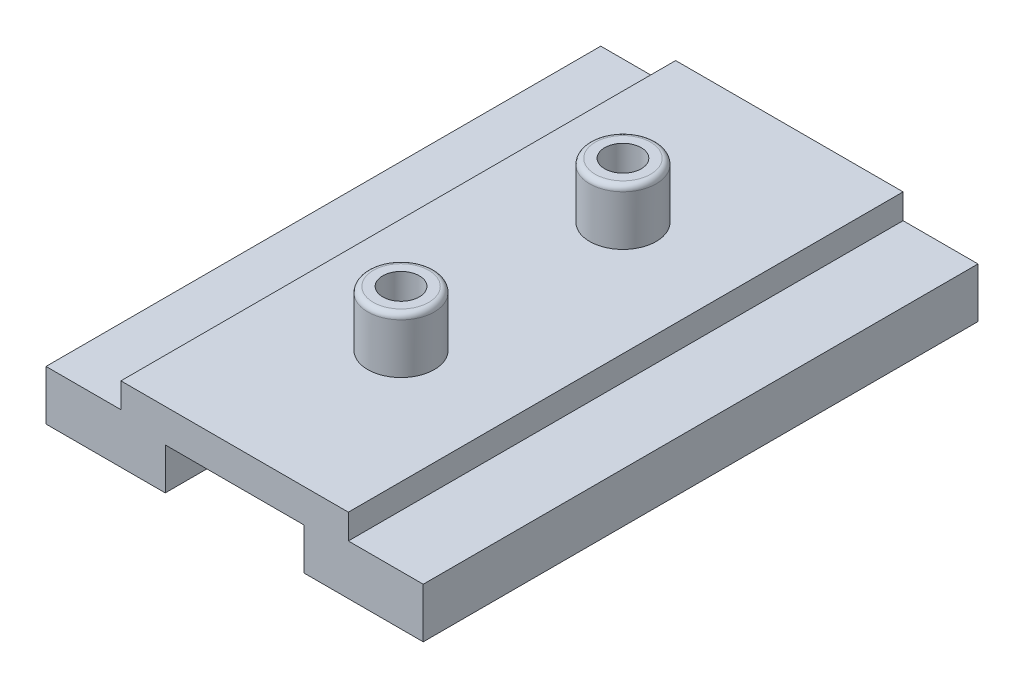
ISO-10303-21;
HEADER;
FILE_DESCRIPTION(('STEP AP214'),'2;1');
FILE_NAME('part.step','',(''),(''),'','','');
FILE_SCHEMA(('AUTOMOTIVE_DESIGN { 1 0 10303 214 1 1 1 1 }'));
ENDSEC;
DATA;
#1=APPLICATION_CONTEXT('core data for automotive mechanical design processes');
#2=APPLICATION_PROTOCOL_DEFINITION('international standard','automotive_design',2000,#1);
#3=PRODUCT_CONTEXT('',#1,'mechanical');
#4=PRODUCT('Part','Part','',(#3));
#5=PRODUCT_RELATED_PRODUCT_CATEGORY('part','',(#4));
#6=PRODUCT_DEFINITION_FORMATION('','',#4);
#7=PRODUCT_DEFINITION_CONTEXT('part definition',#1,'design');
#8=PRODUCT_DEFINITION('design','',#6,#7);
#9=PRODUCT_DEFINITION_SHAPE('','',#8);
#10=(LENGTH_UNIT() NAMED_UNIT(*) SI_UNIT(.MILLI.,.METRE.));
#11=(NAMED_UNIT(*) PLANE_ANGLE_UNIT() SI_UNIT($,.RADIAN.));
#12=(NAMED_UNIT(*) SI_UNIT($,.STERADIAN.) SOLID_ANGLE_UNIT());
#13=UNCERTAINTY_MEASURE_WITH_UNIT(LENGTH_MEASURE(1.E-05),#10,'distance_accuracy_value','');
#14=(GEOMETRIC_REPRESENTATION_CONTEXT(3) GLOBAL_UNCERTAINTY_ASSIGNED_CONTEXT((#13)) GLOBAL_UNIT_ASSIGNED_CONTEXT((#10,
#11,#12)) REPRESENTATION_CONTEXT('',''));
#15=CARTESIAN_POINT('',(0.,0.,0.));
#16=DIRECTION('',(0.,0.,1.));
#17=DIRECTION('',(1.,0.,0.));
#18=AXIS2_PLACEMENT_3D('',#15,#16,#17);
#19=CARTESIAN_POINT('',(6.75,6.75,50.));
#20=DIRECTION('',(0.,-1.,0.));
#21=DIRECTION('',(0.,0.,-1.));
#22=AXIS2_PLACEMENT_3D('',#19,#20,#21);
#23=PLANE('',#22);
#24=CARTESIAN_POINT('',(17.,6.75,15.));
#25=DIRECTION('',(0.,-1.,0.));
#26=DIRECTION('',(0.,0.,-1.));
#27=AXIS2_PLACEMENT_3D('',#24,#25,#26);
#28=CIRCLE('',#27,3.);
#29=CARTESIAN_POINT('',(17.,6.75,12.));
#30=VERTEX_POINT('',#29);
#31=EDGE_CURVE('E206',#30,#30,#28,.F.);
#32=ORIENTED_EDGE('',*,*,#31,.F.);
#33=EDGE_LOOP('',(#32));
#34=FACE_BOUND('',#33,.T.);
#35=DIRECTION('',(-1.,0.,0.));
#36=VECTOR('',#35,1.);
#37=CARTESIAN_POINT('',(6.75,6.75,0.));
#38=LINE('',#37,#36);
#39=CARTESIAN_POINT('',(27.25,6.75,0.));
#40=VERTEX_POINT('',#39);
#41=CARTESIAN_POINT('',(6.75,6.75,0.));
#42=VERTEX_POINT('',#41);
#43=EDGE_CURVE('E174',#40,#42,#38,.T.);
#44=ORIENTED_EDGE('',*,*,#43,.T.);
#45=DIRECTION('',(0.,0.,-1.));
#46=VECTOR('',#45,1.);
#47=CARTESIAN_POINT('',(6.75,6.75,50.));
#48=LINE('',#47,#46);
#49=CARTESIAN_POINT('',(6.75,6.75,50.));
#50=VERTEX_POINT('',#49);
#51=EDGE_CURVE('E147',#50,#42,#48,.T.);
#52=ORIENTED_EDGE('',*,*,#51,.F.);
#53=DIRECTION('',(-1.,0.,0.));
#54=VECTOR('',#53,1.);
#55=CARTESIAN_POINT('',(6.75,6.75,50.));
#56=LINE('',#55,#54);
#57=CARTESIAN_POINT('',(27.25,6.75,50.));
#58=VERTEX_POINT('',#57);
#59=EDGE_CURVE('E138',#58,#50,#56,.T.);
#60=ORIENTED_EDGE('',*,*,#59,.F.);
#61=DIRECTION('',(0.,0.,-1.));
#62=VECTOR('',#61,1.);
#63=CARTESIAN_POINT('',(27.25,6.75,50.));
#64=LINE('',#63,#62);
#65=EDGE_CURVE('E183',#58,#40,#64,.T.);
#66=ORIENTED_EDGE('',*,*,#65,.T.);
#67=EDGE_LOOP('',(#44,#52,#60,#66));
#68=FACE_BOUND('',#67,.T.);
#69=CARTESIAN_POINT('',(17.,6.75,35.));
#70=DIRECTION('',(0.,-1.,0.));
#71=DIRECTION('',(0.,0.,-1.));
#72=AXIS2_PLACEMENT_3D('',#69,#70,#71);
#73=CIRCLE('',#72,3.);
#74=CARTESIAN_POINT('',(17.,6.75,32.));
#75=VERTEX_POINT('',#74);
#76=EDGE_CURVE('E209',#75,#75,#73,.F.);
#77=ORIENTED_EDGE('',*,*,#76,.F.);
#78=EDGE_LOOP('',(#77));
#79=FACE_BOUND('',#78,.T.);
#80=ADVANCED_FACE('F34',(#34,#68,#79),#23,.F.);
#81=CARTESIAN_POINT('',(10.75,0.,50.));
#82=DIRECTION('',(0.,1.,0.));
#83=DIRECTION('',(-1.,0.,0.));
#84=AXIS2_PLACEMENT_3D('',#81,#82,#83);
#85=PLANE('',#84);
#86=DIRECTION('',(1.,0.,0.));
#87=VECTOR('',#86,1.);
#88=CARTESIAN_POINT('',(10.75,0.,0.));
#89=LINE('',#88,#87);
#90=CARTESIAN_POINT('',(0.,0.,0.));
#91=VERTEX_POINT('',#90);
#92=CARTESIAN_POINT('',(10.75,0.,0.));
#93=VERTEX_POINT('',#92);
#94=EDGE_CURVE('E156',#91,#93,#89,.T.);
#95=ORIENTED_EDGE('',*,*,#94,.T.);
#96=DIRECTION('',(0.,0.,-1.));
#97=VECTOR('',#96,1.);
#98=CARTESIAN_POINT('',(10.75,0.,50.));
#99=LINE('',#98,#97);
#100=CARTESIAN_POINT('',(10.75,0.,50.));
#101=VERTEX_POINT('',#100);
#102=EDGE_CURVE('E204',#101,#93,#99,.T.);
#103=ORIENTED_EDGE('',*,*,#102,.F.);
#104=DIRECTION('',(1.,0.,0.));
#105=VECTOR('',#104,1.);
#106=CARTESIAN_POINT('',(10.75,0.,50.));
#107=LINE('',#106,#105);
#108=CARTESIAN_POINT('',(0.,0.,50.));
#109=VERTEX_POINT('',#108);
#110=EDGE_CURVE('E179',#109,#101,#107,.T.);
#111=ORIENTED_EDGE('',*,*,#110,.F.);
#112=DIRECTION('',(0.,0.,-1.));
#113=VECTOR('',#112,1.);
#114=CARTESIAN_POINT('',(0.,0.,50.));
#115=LINE('',#114,#113);
#116=EDGE_CURVE('E152',#109,#91,#115,.T.);
#117=ORIENTED_EDGE('',*,*,#116,.T.);
#118=EDGE_LOOP('',(#95,#103,#111,#117));
#119=FACE_BOUND('',#118,.T.);
#120=ADVANCED_FACE('F238',(#119),#85,.F.);
#121=CARTESIAN_POINT('',(10.75,3.75,50.));
#122=DIRECTION('',(-1.,0.,0.));
#123=DIRECTION('',(0.,0.,1.));
#124=AXIS2_PLACEMENT_3D('',#121,#122,#123);
#125=PLANE('',#124);
#126=DIRECTION('',(0.,1.,0.));
#127=VECTOR('',#126,1.);
#128=CARTESIAN_POINT('',(10.75,3.75,0.));
#129=LINE('',#128,#127);
#130=CARTESIAN_POINT('',(10.75,3.75,0.));
#131=VERTEX_POINT('',#130);
#132=EDGE_CURVE('E159',#93,#131,#129,.T.);
#133=ORIENTED_EDGE('',*,*,#132,.T.);
#134=DIRECTION('',(0.,0.,-1.));
#135=VECTOR('',#134,1.);
#136=CARTESIAN_POINT('',(10.75,3.75,50.));
#137=LINE('',#136,#135);
#138=CARTESIAN_POINT('',(10.75,3.75,50.));
#139=VERTEX_POINT('',#138);
#140=EDGE_CURVE('E201',#139,#131,#137,.T.);
#141=ORIENTED_EDGE('',*,*,#140,.F.);
#142=DIRECTION('',(0.,1.,0.));
#143=VECTOR('',#142,1.);
#144=CARTESIAN_POINT('',(10.75,3.75,50.));
#145=LINE('',#144,#143);
#146=EDGE_CURVE('E107',#101,#139,#145,.T.);
#147=ORIENTED_EDGE('',*,*,#146,.F.);
#148=ORIENTED_EDGE('',*,*,#102,.T.);
#149=EDGE_LOOP('',(#133,#141,#147,#148));
#150=FACE_BOUND('',#149,.T.);
#151=ADVANCED_FACE('F244',(#150),#125,.F.);
#152=CARTESIAN_POINT('',(10.75,3.75,50.));
#153=DIRECTION('',(0.,1.,0.));
#154=DIRECTION('',(0.,0.,1.));
#155=AXIS2_PLACEMENT_3D('',#152,#153,#154);
#156=PLANE('',#155);
#157=CARTESIAN_POINT('',(17.,3.75,15.));
#158=DIRECTION('',(0.,1.,0.));
#159=DIRECTION('',(0.,0.,1.));
#160=AXIS2_PLACEMENT_3D('',#157,#158,#159);
#161=CIRCLE('',#160,1.65);
#162=CARTESIAN_POINT('',(17.,3.75,16.65));
#163=VERTEX_POINT('',#162);
#164=EDGE_CURVE('E213',#163,#163,#161,.T.);
#165=ORIENTED_EDGE('',*,*,#164,.T.);
#166=EDGE_LOOP('',(#165));
#167=FACE_BOUND('',#166,.T.);
#168=CARTESIAN_POINT('',(17.,3.75,35.));
#169=DIRECTION('',(0.,1.,0.));
#170=DIRECTION('',(0.,0.,1.));
#171=AXIS2_PLACEMENT_3D('',#168,#169,#170);
#172=CIRCLE('',#171,1.65);
#173=CARTESIAN_POINT('',(17.,3.75,36.65));
#174=VERTEX_POINT('',#173);
#175=EDGE_CURVE('E160',#174,#174,#172,.T.);
#176=ORIENTED_EDGE('',*,*,#175,.T.);
#177=EDGE_LOOP('',(#176));
#178=FACE_BOUND('',#177,.T.);
#179=DIRECTION('',(1.,0.,0.));
#180=VECTOR('',#179,1.);
#181=CARTESIAN_POINT('',(10.75,3.75,0.));
#182=LINE('',#181,#180);
#183=CARTESIAN_POINT('',(23.25,3.75,0.));
#184=VERTEX_POINT('',#183);
#185=EDGE_CURVE('E162',#131,#184,#182,.T.);
#186=ORIENTED_EDGE('',*,*,#185,.T.);
#187=DIRECTION('',(0.,0.,-1.));
#188=VECTOR('',#187,1.);
#189=CARTESIAN_POINT('',(23.25,3.75,50.));
#190=LINE('',#189,#188);
#191=CARTESIAN_POINT('',(23.25,3.75,50.));
#192=VERTEX_POINT('',#191);
#193=EDGE_CURVE('E198',#192,#184,#190,.T.);
#194=ORIENTED_EDGE('',*,*,#193,.F.);
#195=DIRECTION('',(1.,0.,0.));
#196=VECTOR('',#195,1.);
#197=CARTESIAN_POINT('',(10.75,3.75,50.));
#198=LINE('',#197,#196);
#199=EDGE_CURVE('E286',#139,#192,#198,.T.);
#200=ORIENTED_EDGE('',*,*,#199,.F.);
#201=ORIENTED_EDGE('',*,*,#140,.T.);
#202=EDGE_LOOP('',(#186,#194,#200,#201));
#203=FACE_BOUND('',#202,.T.);
#204=ADVANCED_FACE('F271',(#167,#178,#203),#156,.F.);
#205=CARTESIAN_POINT('',(23.25,3.75,50.));
#206=DIRECTION('',(1.,0.,0.));
#207=DIRECTION('',(0.,0.,-1.));
#208=AXIS2_PLACEMENT_3D('',#205,#206,#207);
#209=PLANE('',#208);
#210=DIRECTION('',(0.,-1.,0.));
#211=VECTOR('',#210,1.);
#212=CARTESIAN_POINT('',(23.25,3.75,0.));
#213=LINE('',#212,#211);
#214=CARTESIAN_POINT('',(23.25,0.,0.));
#215=VERTEX_POINT('',#214);
#216=EDGE_CURVE('E164',#184,#215,#213,.T.);
#217=ORIENTED_EDGE('',*,*,#216,.T.);
#218=DIRECTION('',(0.,0.,-1.));
#219=VECTOR('',#218,1.);
#220=CARTESIAN_POINT('',(23.25,0.,50.));
#221=LINE('',#220,#219);
#222=CARTESIAN_POINT('',(23.25,0.,50.));
#223=VERTEX_POINT('',#222);
#224=EDGE_CURVE('E195',#223,#215,#221,.T.);
#225=ORIENTED_EDGE('',*,*,#224,.F.);
#226=DIRECTION('',(0.,-1.,0.));
#227=VECTOR('',#226,1.);
#228=CARTESIAN_POINT('',(23.25,3.75,50.));
#229=LINE('',#228,#227);
#230=EDGE_CURVE('E298',#192,#223,#229,.T.);
#231=ORIENTED_EDGE('',*,*,#230,.F.);
#232=ORIENTED_EDGE('',*,*,#193,.T.);
#233=EDGE_LOOP('',(#217,#225,#231,#232));
#234=FACE_BOUND('',#233,.T.);
#235=ADVANCED_FACE('F267',(#234),#209,.F.);
#236=CARTESIAN_POINT('',(34.,0.,50.));
#237=DIRECTION('',(0.,1.,0.));
#238=DIRECTION('',(-1.,0.,0.));
#239=AXIS2_PLACEMENT_3D('',#236,#237,#238);
#240=PLANE('',#239);
#241=DIRECTION('',(1.,0.,0.));
#242=VECTOR('',#241,1.);
#243=CARTESIAN_POINT('',(34.,0.,0.));
#244=LINE('',#243,#242);
#245=CARTESIAN_POINT('',(34.,0.,0.));
#246=VERTEX_POINT('',#245);
#247=EDGE_CURVE('E166',#215,#246,#244,.T.);
#248=ORIENTED_EDGE('',*,*,#247,.T.);
#249=DIRECTION('',(0.,0.,-1.));
#250=VECTOR('',#249,1.);
#251=CARTESIAN_POINT('',(34.,0.,50.));
#252=LINE('',#251,#250);
#253=CARTESIAN_POINT('',(34.,0.,50.));
#254=VERTEX_POINT('',#253);
#255=EDGE_CURVE('E192',#254,#246,#252,.T.);
#256=ORIENTED_EDGE('',*,*,#255,.F.);
#257=DIRECTION('',(1.,0.,0.));
#258=VECTOR('',#257,1.);
#259=CARTESIAN_POINT('',(34.,0.,50.));
#260=LINE('',#259,#258);
#261=EDGE_CURVE('E295',#223,#254,#260,.T.);
#262=ORIENTED_EDGE('',*,*,#261,.F.);
#263=ORIENTED_EDGE('',*,*,#224,.T.);
#264=EDGE_LOOP('',(#248,#256,#262,#263));
#265=FACE_BOUND('',#264,.T.);
#266=ADVANCED_FACE('F263',(#265),#240,.F.);
#267=CARTESIAN_POINT('',(34.,4.5,50.));
#268=DIRECTION('',(-1.,0.,0.));
#269=DIRECTION('',(0.,0.,1.));
#270=AXIS2_PLACEMENT_3D('',#267,#268,#269);
#271=PLANE('',#270);
#272=DIRECTION('',(0.,1.,0.));
#273=VECTOR('',#272,1.);
#274=CARTESIAN_POINT('',(34.,4.5,0.));
#275=LINE('',#274,#273);
#276=CARTESIAN_POINT('',(34.,4.5,0.));
#277=VERTEX_POINT('',#276);
#278=EDGE_CURVE('E168',#246,#277,#275,.T.);
#279=ORIENTED_EDGE('',*,*,#278,.T.);
#280=DIRECTION('',(0.,0.,-1.));
#281=VECTOR('',#280,1.);
#282=CARTESIAN_POINT('',(34.,4.5,50.));
#283=LINE('',#282,#281);
#284=CARTESIAN_POINT('',(34.,4.5,50.));
#285=VERTEX_POINT('',#284);
#286=EDGE_CURVE('E189',#285,#277,#283,.T.);
#287=ORIENTED_EDGE('',*,*,#286,.F.);
#288=DIRECTION('',(0.,1.,0.));
#289=VECTOR('',#288,1.);
#290=CARTESIAN_POINT('',(34.,4.5,50.));
#291=LINE('',#290,#289);
#292=EDGE_CURVE('E297',#254,#285,#291,.T.);
#293=ORIENTED_EDGE('',*,*,#292,.F.);
#294=ORIENTED_EDGE('',*,*,#255,.T.);
#295=EDGE_LOOP('',(#279,#287,#293,#294));
#296=FACE_BOUND('',#295,.T.);
#297=ADVANCED_FACE('F259',(#296),#271,.F.);
#298=CARTESIAN_POINT('',(27.25,4.5,50.));
#299=DIRECTION('',(0.,-1.,0.));
#300=DIRECTION('',(1.,0.,0.));
#301=AXIS2_PLACEMENT_3D('',#298,#299,#300);
#302=PLANE('',#301);
#303=DIRECTION('',(-1.,0.,0.));
#304=VECTOR('',#303,1.);
#305=CARTESIAN_POINT('',(27.25,4.5,0.));
#306=LINE('',#305,#304);
#307=CARTESIAN_POINT('',(27.25,4.5,0.));
#308=VERTEX_POINT('',#307);
#309=EDGE_CURVE('E170',#277,#308,#306,.T.);
#310=ORIENTED_EDGE('',*,*,#309,.T.);
#311=DIRECTION('',(0.,0.,-1.));
#312=VECTOR('',#311,1.);
#313=CARTESIAN_POINT('',(27.25,4.5,50.));
#314=LINE('',#313,#312);
#315=CARTESIAN_POINT('',(27.25,4.5,50.));
#316=VERTEX_POINT('',#315);
#317=EDGE_CURVE('E186',#316,#308,#314,.T.);
#318=ORIENTED_EDGE('',*,*,#317,.F.);
#319=DIRECTION('',(-1.,0.,0.));
#320=VECTOR('',#319,1.);
#321=CARTESIAN_POINT('',(27.25,4.5,50.));
#322=LINE('',#321,#320);
#323=EDGE_CURVE('E300',#285,#316,#322,.T.);
#324=ORIENTED_EDGE('',*,*,#323,.F.);
#325=ORIENTED_EDGE('',*,*,#286,.T.);
#326=EDGE_LOOP('',(#310,#318,#324,#325));
#327=FACE_BOUND('',#326,.T.);
#328=ADVANCED_FACE('F255',(#327),#302,.F.);
#329=CARTESIAN_POINT('',(27.25,6.75,50.));
#330=DIRECTION('',(-1.,0.,0.));
#331=DIRECTION('',(0.,0.,1.));
#332=AXIS2_PLACEMENT_3D('',#329,#330,#331);
#333=PLANE('',#332);
#334=DIRECTION('',(0.,1.,0.));
#335=VECTOR('',#334,1.);
#336=CARTESIAN_POINT('',(27.25,6.75,0.));
#337=LINE('',#336,#335);
#338=EDGE_CURVE('E172',#308,#40,#337,.T.);
#339=ORIENTED_EDGE('',*,*,#338,.T.);
#340=ORIENTED_EDGE('',*,*,#65,.F.);
#341=DIRECTION('',(0.,1.,0.));
#342=VECTOR('',#341,1.);
#343=CARTESIAN_POINT('',(27.25,6.75,50.));
#344=LINE('',#343,#342);
#345=EDGE_CURVE('E306',#316,#58,#344,.T.);
#346=ORIENTED_EDGE('',*,*,#345,.F.);
#347=ORIENTED_EDGE('',*,*,#317,.T.);
#348=EDGE_LOOP('',(#339,#340,#346,#347));
#349=FACE_BOUND('',#348,.T.);
#350=ADVANCED_FACE('F252',(#349),#333,.F.);
#351=CARTESIAN_POINT('',(6.75,4.5,50.));
#352=DIRECTION('',(1.,0.,0.));
#353=DIRECTION('',(0.,1.,0.));
#354=AXIS2_PLACEMENT_3D('',#351,#352,#353);
#355=PLANE('',#354);
#356=DIRECTION('',(0.,-1.,0.));
#357=VECTOR('',#356,1.);
#358=CARTESIAN_POINT('',(6.75,4.5,0.));
#359=LINE('',#358,#357);
#360=CARTESIAN_POINT('',(6.75,4.5,0.));
#361=VERTEX_POINT('',#360);
#362=EDGE_CURVE('E146',#42,#361,#359,.T.);
#363=ORIENTED_EDGE('',*,*,#362,.T.);
#364=DIRECTION('',(0.,0.,-1.));
#365=VECTOR('',#364,1.);
#366=CARTESIAN_POINT('',(6.75,4.5,50.));
#367=LINE('',#366,#365);
#368=CARTESIAN_POINT('',(6.75,4.5,50.));
#369=VERTEX_POINT('',#368);
#370=EDGE_CURVE('E143',#369,#361,#367,.T.);
#371=ORIENTED_EDGE('',*,*,#370,.F.);
#372=DIRECTION('',(0.,-1.,0.));
#373=VECTOR('',#372,1.);
#374=CARTESIAN_POINT('',(6.75,4.5,50.));
#375=LINE('',#374,#373);
#376=EDGE_CURVE('E132',#50,#369,#375,.T.);
#377=ORIENTED_EDGE('',*,*,#376,.F.);
#378=ORIENTED_EDGE('',*,*,#51,.T.);
#379=EDGE_LOOP('',(#363,#371,#377,#378));
#380=FACE_BOUND('',#379,.T.);
#381=ADVANCED_FACE('F144',(#380),#355,.F.);
#382=CARTESIAN_POINT('',(0.,4.5,50.));
#383=DIRECTION('',(0.,-1.,0.));
#384=DIRECTION('',(1.,0.,0.));
#385=AXIS2_PLACEMENT_3D('',#382,#383,#384);
#386=PLANE('',#385);
#387=DIRECTION('',(-1.,0.,0.));
#388=VECTOR('',#387,1.);
#389=CARTESIAN_POINT('',(0.,4.5,0.));
#390=LINE('',#389,#388);
#391=CARTESIAN_POINT('',(0.,4.5,0.));
#392=VERTEX_POINT('',#391);
#393=EDGE_CURVE('E92',#361,#392,#390,.T.);
#394=ORIENTED_EDGE('',*,*,#393,.T.);
#395=DIRECTION('',(0.,0.,-1.));
#396=VECTOR('',#395,1.);
#397=CARTESIAN_POINT('',(0.,4.5,50.));
#398=LINE('',#397,#396);
#399=CARTESIAN_POINT('',(0.,4.5,50.));
#400=VERTEX_POINT('',#399);
#401=EDGE_CURVE('E148',#400,#392,#398,.T.);
#402=ORIENTED_EDGE('',*,*,#401,.F.);
#403=DIRECTION('',(-1.,0.,0.));
#404=VECTOR('',#403,1.);
#405=CARTESIAN_POINT('',(0.,4.5,50.));
#406=LINE('',#405,#404);
#407=EDGE_CURVE('E136',#369,#400,#406,.T.);
#408=ORIENTED_EDGE('',*,*,#407,.F.);
#409=ORIENTED_EDGE('',*,*,#370,.T.);
#410=EDGE_LOOP('',(#394,#402,#408,#409));
#411=FACE_BOUND('',#410,.T.);
#412=ADVANCED_FACE('F150',(#411),#386,.F.);
#413=CARTESIAN_POINT('',(0.,0.,50.));
#414=DIRECTION('',(1.,0.,0.));
#415=DIRECTION('',(0.,0.,-1.));
#416=AXIS2_PLACEMENT_3D('',#413,#414,#415);
#417=PLANE('',#416);
#418=DIRECTION('',(0.,-1.,0.));
#419=VECTOR('',#418,1.);
#420=CARTESIAN_POINT('',(0.,0.,0.));
#421=LINE('',#420,#419);
#422=EDGE_CURVE('E98',#392,#91,#421,.T.);
#423=ORIENTED_EDGE('',*,*,#422,.T.);
#424=ORIENTED_EDGE('',*,*,#116,.F.);
#425=DIRECTION('',(0.,-1.,0.));
#426=VECTOR('',#425,1.);
#427=CARTESIAN_POINT('',(0.,0.,50.));
#428=LINE('',#427,#426);
#429=EDGE_CURVE('E51',#400,#109,#428,.T.);
#430=ORIENTED_EDGE('',*,*,#429,.F.);
#431=ORIENTED_EDGE('',*,*,#401,.T.);
#432=EDGE_LOOP('',(#423,#424,#430,#431));
#433=FACE_BOUND('',#432,.T.);
#434=ADVANCED_FACE('F315',(#433),#417,.F.);
#435=CARTESIAN_POINT('',(0.,0.,50.));
#436=DIRECTION('',(0.,0.,-1.));
#437=DIRECTION('',(-1.,0.,0.));
#438=AXIS2_PLACEMENT_3D('',#435,#436,#437);
#439=PLANE('',#438);
#440=ORIENTED_EDGE('',*,*,#110,.T.);
#441=ORIENTED_EDGE('',*,*,#146,.T.);
#442=ORIENTED_EDGE('',*,*,#199,.T.);
#443=ORIENTED_EDGE('',*,*,#230,.T.);
#444=ORIENTED_EDGE('',*,*,#261,.T.);
#445=ORIENTED_EDGE('',*,*,#292,.T.);
#446=ORIENTED_EDGE('',*,*,#323,.T.);
#447=ORIENTED_EDGE('',*,*,#345,.T.);
#448=ORIENTED_EDGE('',*,*,#59,.T.);
#449=ORIENTED_EDGE('',*,*,#376,.T.);
#450=ORIENTED_EDGE('',*,*,#407,.T.);
#451=ORIENTED_EDGE('',*,*,#429,.T.);
#452=EDGE_LOOP('',(#440,#441,#442,#443,#444,#445,#446,#447,#448,#449,#450,#451));
#453=FACE_BOUND('',#452,.T.);
#454=ADVANCED_FACE('F134',(#453),#439,.F.);
#455=CARTESIAN_POINT('',(0.,0.,0.));
#456=DIRECTION('',(0.,0.,-1.));
#457=DIRECTION('',(-1.,0.,0.));
#458=AXIS2_PLACEMENT_3D('',#455,#456,#457);
#459=PLANE('',#458);
#460=ORIENTED_EDGE('',*,*,#94,.F.);
#461=ORIENTED_EDGE('',*,*,#422,.F.);
#462=ORIENTED_EDGE('',*,*,#393,.F.);
#463=ORIENTED_EDGE('',*,*,#362,.F.);
#464=ORIENTED_EDGE('',*,*,#43,.F.);
#465=ORIENTED_EDGE('',*,*,#338,.F.);
#466=ORIENTED_EDGE('',*,*,#309,.F.);
#467=ORIENTED_EDGE('',*,*,#278,.F.);
#468=ORIENTED_EDGE('',*,*,#247,.F.);
#469=ORIENTED_EDGE('',*,*,#216,.F.);
#470=ORIENTED_EDGE('',*,*,#185,.F.);
#471=ORIENTED_EDGE('',*,*,#132,.F.);
#472=EDGE_LOOP('',(#460,#461,#462,#463,#464,#465,#466,#467,#468,#469,#470,#471));
#473=FACE_BOUND('',#472,.T.);
#474=ADVANCED_FACE('F288',(#473),#459,.T.);
#475=CARTESIAN_POINT('',(17.,11.75,15.));
#476=DIRECTION('',(0.,-1.,0.));
#477=DIRECTION('',(0.,0.,-1.));
#478=AXIS2_PLACEMENT_3D('',#475,#476,#477);
#479=CYLINDRICAL_SURFACE('',#478,3.);
#480=CARTESIAN_POINT('',(17.,11.25,15.));
#481=DIRECTION('',(0.,1.,0.));
#482=DIRECTION('',(0.,0.,1.));
#483=AXIS2_PLACEMENT_3D('',#480,#481,#482);
#484=CIRCLE('',#483,3.);
#485=CARTESIAN_POINT('',(17.,11.25,18.));
#486=VERTEX_POINT('',#485);
#487=EDGE_CURVE('E220',#486,#486,#484,.F.);
#488=ORIENTED_EDGE('',*,*,#487,.T.);
#489=EDGE_LOOP('',(#488));
#490=FACE_BOUND('',#489,.T.);
#491=ORIENTED_EDGE('',*,*,#31,.T.);
#492=EDGE_LOOP('',(#491));
#493=FACE_BOUND('',#492,.T.);
#494=ADVANCED_FACE('F325',(#490,#493),#479,.T.);
#495=CARTESIAN_POINT('',(17.,11.75,15.));
#496=DIRECTION('',(0.,1.,0.));
#497=DIRECTION('',(0.,0.,1.));
#498=AXIS2_PLACEMENT_3D('',#495,#496,#497);
#499=PLANE('',#498);
#500=CARTESIAN_POINT('',(17.,11.75,15.));
#501=DIRECTION('',(0.,1.,0.));
#502=DIRECTION('',(0.,0.,1.));
#503=AXIS2_PLACEMENT_3D('',#500,#501,#502);
#504=CIRCLE('',#503,2.5);
#505=CARTESIAN_POINT('',(17.,11.75,17.5));
#506=VERTEX_POINT('',#505);
#507=EDGE_CURVE('E212',#506,#506,#504,.T.);
#508=ORIENTED_EDGE('',*,*,#507,.T.);
#509=EDGE_LOOP('',(#508));
#510=FACE_BOUND('',#509,.T.);
#511=CARTESIAN_POINT('',(17.,11.75,15.));
#512=DIRECTION('',(0.,1.,0.));
#513=DIRECTION('',(0.,0.,1.));
#514=AXIS2_PLACEMENT_3D('',#511,#512,#513);
#515=CIRCLE('',#514,1.65);
#516=CARTESIAN_POINT('',(17.,11.75,16.65));
#517=VERTEX_POINT('',#516);
#518=EDGE_CURVE('E217',#517,#517,#515,.T.);
#519=ORIENTED_EDGE('',*,*,#518,.F.);
#520=EDGE_LOOP('',(#519));
#521=FACE_BOUND('',#520,.T.);
#522=ADVANCED_FACE('F329',(#510,#521),#499,.T.);
#523=CARTESIAN_POINT('',(17.,11.75,35.));
#524=DIRECTION('',(0.,-1.,0.));
#525=DIRECTION('',(0.,0.,-1.));
#526=AXIS2_PLACEMENT_3D('',#523,#524,#525);
#527=CYLINDRICAL_SURFACE('',#526,3.);
#528=CARTESIAN_POINT('',(17.,11.25,35.));
#529=DIRECTION('',(0.,1.,0.));
#530=DIRECTION('',(0.,0.,1.));
#531=AXIS2_PLACEMENT_3D('',#528,#529,#530);
#532=CIRCLE('',#531,3.);
#533=CARTESIAN_POINT('',(17.,11.25,38.));
#534=VERTEX_POINT('',#533);
#535=EDGE_CURVE('E11',#534,#534,#532,.F.);
#536=ORIENTED_EDGE('',*,*,#535,.T.);
#537=EDGE_LOOP('',(#536));
#538=FACE_BOUND('',#537,.T.);
#539=ORIENTED_EDGE('',*,*,#76,.T.);
#540=EDGE_LOOP('',(#539));
#541=FACE_BOUND('',#540,.T.);
#542=ADVANCED_FACE('F333',(#538,#541),#527,.T.);
#543=CARTESIAN_POINT('',(17.,11.75,35.));
#544=DIRECTION('',(0.,1.,0.));
#545=DIRECTION('',(0.,0.,1.));
#546=AXIS2_PLACEMENT_3D('',#543,#544,#545);
#547=PLANE('',#546);
#548=CARTESIAN_POINT('',(17.,11.75,35.));
#549=DIRECTION('',(0.,1.,0.));
#550=DIRECTION('',(0.,0.,1.));
#551=AXIS2_PLACEMENT_3D('',#548,#549,#550);
#552=CIRCLE('',#551,2.5);
#553=CARTESIAN_POINT('',(17.,11.75,37.5));
#554=VERTEX_POINT('',#553);
#555=EDGE_CURVE('E43',#554,#554,#552,.T.);
#556=ORIENTED_EDGE('',*,*,#555,.T.);
#557=EDGE_LOOP('',(#556));
#558=FACE_BOUND('',#557,.T.);
#559=CARTESIAN_POINT('',(17.,11.75,35.));
#560=DIRECTION('',(0.,1.,0.));
#561=DIRECTION('',(0.,0.,1.));
#562=AXIS2_PLACEMENT_3D('',#559,#560,#561);
#563=CIRCLE('',#562,1.65);
#564=CARTESIAN_POINT('',(17.,11.75,36.65));
#565=VERTEX_POINT('',#564);
#566=EDGE_CURVE('E216',#565,#565,#563,.T.);
#567=ORIENTED_EDGE('',*,*,#566,.F.);
#568=EDGE_LOOP('',(#567));
#569=FACE_BOUND('',#568,.T.);
#570=ADVANCED_FACE('F225',(#558,#569),#547,.T.);
#571=CARTESIAN_POINT('',(17.,11.75,35.));
#572=DIRECTION('',(0.,1.,0.));
#573=DIRECTION('',(0.,0.,1.));
#574=AXIS2_PLACEMENT_3D('',#571,#572,#573);
#575=CYLINDRICAL_SURFACE('',#574,1.65);
#576=ORIENTED_EDGE('',*,*,#566,.T.);
#577=EDGE_LOOP('',(#576));
#578=FACE_BOUND('',#577,.T.);
#579=ORIENTED_EDGE('',*,*,#175,.F.);
#580=EDGE_LOOP('',(#579));
#581=FACE_BOUND('',#580,.T.);
#582=ADVANCED_FACE('F340',(#578,#581),#575,.F.);
#583=CARTESIAN_POINT('',(17.,11.75,15.));
#584=DIRECTION('',(0.,1.,0.));
#585=DIRECTION('',(0.,0.,1.));
#586=AXIS2_PLACEMENT_3D('',#583,#584,#585);
#587=CYLINDRICAL_SURFACE('',#586,1.65);
#588=ORIENTED_EDGE('',*,*,#518,.T.);
#589=EDGE_LOOP('',(#588));
#590=FACE_BOUND('',#589,.T.);
#591=ORIENTED_EDGE('',*,*,#164,.F.);
#592=EDGE_LOOP('',(#591));
#593=FACE_BOUND('',#592,.T.);
#594=ADVANCED_FACE('F234',(#590,#593),#587,.F.);
#595=CARTESIAN_POINT('',(17.,11.25,15.));
#596=DIRECTION('',(0.,1.,0.));
#597=DIRECTION('',(0.,0.,1.));
#598=AXIS2_PLACEMENT_3D('',#595,#596,#597);
#599=TOROIDAL_SURFACE('',#598,2.5,0.5);
#600=ORIENTED_EDGE('',*,*,#487,.F.);
#601=EDGE_LOOP('',(#600));
#602=FACE_BOUND('',#601,.T.);
#603=ORIENTED_EDGE('',*,*,#507,.F.);
#604=EDGE_LOOP('',(#603));
#605=FACE_BOUND('',#604,.T.);
#606=ADVANCED_FACE('F229',(#602,#605),#599,.T.);
#607=CARTESIAN_POINT('',(17.,11.25,35.));
#608=DIRECTION('',(0.,1.,0.));
#609=DIRECTION('',(0.,0.,1.));
#610=AXIS2_PLACEMENT_3D('',#607,#608,#609);
#611=TOROIDAL_SURFACE('',#610,2.5,0.5);
#612=ORIENTED_EDGE('',*,*,#535,.F.);
#613=EDGE_LOOP('',(#612));
#614=FACE_BOUND('',#613,.T.);
#615=ORIENTED_EDGE('',*,*,#555,.F.);
#616=EDGE_LOOP('',(#615));
#617=FACE_BOUND('',#616,.T.);
#618=ADVANCED_FACE('F36',(#614,#617),#611,.T.);
#619=CLOSED_SHELL('',(#80,#120,#151,#204,#235,#266,#297,#328,#350,#381,#412,#434,#454,#474,#494,
#522,#542,#570,#582,#594,#606,#618));
#620=MANIFOLD_SOLID_BREP('B2',#619);
#621=ADVANCED_BREP_SHAPE_REPRESENTATION('',(#18,#620),#14);
#622=SHAPE_DEFINITION_REPRESENTATION(#9,#621);
ENDSEC;
END-ISO-10303-21;
